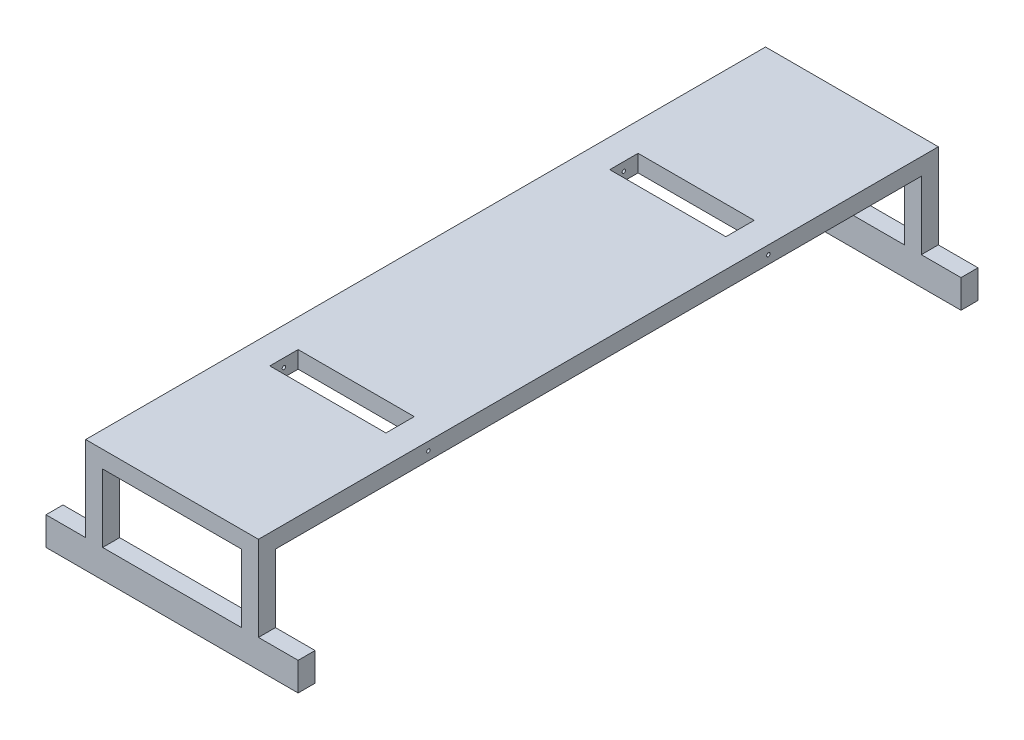
ISO-10303-21;
HEADER;
FILE_DESCRIPTION(('STEP AP214'),'2;1');
FILE_NAME('part.step','',(''),(''),'','','');
FILE_SCHEMA(('AUTOMOTIVE_DESIGN { 1 0 10303 214 1 1 1 1 }'));
ENDSEC;
DATA;
#1=APPLICATION_CONTEXT('core data for automotive mechanical design processes');
#2=APPLICATION_PROTOCOL_DEFINITION('international standard','automotive_design',2000,#1);
#3=PRODUCT_CONTEXT('',#1,'mechanical');
#4=PRODUCT('Part','Part','',(#3));
#5=PRODUCT_RELATED_PRODUCT_CATEGORY('part','',(#4));
#6=PRODUCT_DEFINITION_FORMATION('','',#4);
#7=PRODUCT_DEFINITION_CONTEXT('part definition',#1,'design');
#8=PRODUCT_DEFINITION('design','',#6,#7);
#9=PRODUCT_DEFINITION_SHAPE('','',#8);
#10=(LENGTH_UNIT() NAMED_UNIT(*) SI_UNIT(.MILLI.,.METRE.));
#11=(NAMED_UNIT(*) PLANE_ANGLE_UNIT() SI_UNIT($,.RADIAN.));
#12=(NAMED_UNIT(*) SI_UNIT($,.STERADIAN.) SOLID_ANGLE_UNIT());
#13=UNCERTAINTY_MEASURE_WITH_UNIT(LENGTH_MEASURE(1.E-05),#10,'distance_accuracy_value','');
#14=(GEOMETRIC_REPRESENTATION_CONTEXT(3) GLOBAL_UNCERTAINTY_ASSIGNED_CONTEXT((#13)) GLOBAL_UNIT_ASSIGNED_CONTEXT((#10,
#11,#12)) REPRESENTATION_CONTEXT('',''));
#15=CARTESIAN_POINT('',(0.,0.,0.));
#16=DIRECTION('',(0.,0.,1.));
#17=DIRECTION('',(1.,0.,0.));
#18=AXIS2_PLACEMENT_3D('',#15,#16,#17);
#19=CARTESIAN_POINT('',(0.,150.000000000003,1200.));
#20=DIRECTION('',(0.,1.,0.));
#21=DIRECTION('',(0.,0.,1.));
#22=AXIS2_PLACEMENT_3D('',#19,#20,#21);
#23=PLANE('',#22);
#24=DIRECTION('',(1.,0.,0.));
#25=VECTOR('',#24,1.);
#26=CARTESIAN_POINT('',(0.,150.000000000003,0.));
#27=LINE('',#26,#25);
#28=CARTESIAN_POINT('',(-152.500000000002,150.000000000003,0.));
#29=VERTEX_POINT('',#28);
#30=CARTESIAN_POINT('',(152.500000000002,150.000000000003,0.));
#31=VERTEX_POINT('',#30);
#32=EDGE_CURVE('E432',#29,#31,#27,.T.);
#33=ORIENTED_EDGE('',*,*,#32,.F.);
#34=DIRECTION('',(0.,0.,-1.));
#35=VECTOR('',#34,1.);
#36=CARTESIAN_POINT('',(-152.500000000002,150.000000000003,1200.));
#37=LINE('',#36,#35);
#38=CARTESIAN_POINT('',(-152.500000000002,150.000000000003,1200.));
#39=VERTEX_POINT('',#38);
#40=EDGE_CURVE('E466',#39,#29,#37,.T.);
#41=ORIENTED_EDGE('',*,*,#40,.F.);
#42=DIRECTION('',(1.,0.,0.));
#43=VECTOR('',#42,1.);
#44=CARTESIAN_POINT('',(0.,150.000000000003,1200.));
#45=LINE('',#44,#43);
#46=CARTESIAN_POINT('',(152.500000000002,150.000000000003,1200.));
#47=VERTEX_POINT('',#46);
#48=EDGE_CURVE('E410',#39,#47,#45,.T.);
#49=ORIENTED_EDGE('',*,*,#48,.T.);
#50=DIRECTION('',(0.,0.,-1.));
#51=VECTOR('',#50,1.);
#52=CARTESIAN_POINT('',(152.500000000002,150.000000000003,1200.));
#53=LINE('',#52,#51);
#54=EDGE_CURVE('E469',#47,#31,#53,.T.);
#55=ORIENTED_EDGE('',*,*,#54,.T.);
#56=EDGE_LOOP('',(#33,#41,#49,#55));
#57=FACE_BOUND('',#56,.T.);
#58=DIRECTION('',(1.,0.,0.));
#59=VECTOR('',#58,1.);
#60=CARTESIAN_POINT('',(102.499999999972,150.000000000003,925.));
#61=LINE('',#60,#59);
#62=CARTESIAN_POINT('',(-102.499999999972,150.000000000003,925.));
#63=VERTEX_POINT('',#62);
#64=CARTESIAN_POINT('',(102.499999999972,150.000000000003,925.));
#65=VERTEX_POINT('',#64);
#66=EDGE_CURVE('E317',#63,#65,#61,.T.);
#67=ORIENTED_EDGE('',*,*,#66,.F.);
#68=DIRECTION('',(0.,0.,1.));
#69=VECTOR('',#68,1.);
#70=CARTESIAN_POINT('',(-102.499999999972,150.000000000003,925.));
#71=LINE('',#70,#69);
#72=CARTESIAN_POINT('',(-102.499999999972,150.000000000003,875.));
#73=VERTEX_POINT('',#72);
#74=EDGE_CURVE('E269',#73,#63,#71,.T.);
#75=ORIENTED_EDGE('',*,*,#74,.F.);
#76=DIRECTION('',(-1.,0.,0.));
#77=VECTOR('',#76,1.);
#78=CARTESIAN_POINT('',(102.499999999972,150.000000000003,875.));
#79=LINE('',#78,#77);
#80=CARTESIAN_POINT('',(102.499999999972,150.000000000003,875.));
#81=VERTEX_POINT('',#80);
#82=EDGE_CURVE('E311',#81,#73,#79,.T.);
#83=ORIENTED_EDGE('',*,*,#82,.F.);
#84=DIRECTION('',(0.,0.,-1.));
#85=VECTOR('',#84,1.);
#86=CARTESIAN_POINT('',(102.499999999972,150.000000000003,925.));
#87=LINE('',#86,#85);
#88=EDGE_CURVE('E314',#65,#81,#87,.T.);
#89=ORIENTED_EDGE('',*,*,#88,.F.);
#90=EDGE_LOOP('',(#67,#75,#83,#89));
#91=FACE_BOUND('',#90,.T.);
#92=DIRECTION('',(1.,0.,0.));
#93=VECTOR('',#92,1.);
#94=CARTESIAN_POINT('',(102.5,150.000000000003,325.));
#95=LINE('',#94,#93);
#96=CARTESIAN_POINT('',(-102.5,150.000000000003,325.));
#97=VERTEX_POINT('',#96);
#98=CARTESIAN_POINT('',(102.5,150.000000000003,325.));
#99=VERTEX_POINT('',#98);
#100=EDGE_CURVE('E268',#97,#99,#95,.T.);
#101=ORIENTED_EDGE('',*,*,#100,.F.);
#102=DIRECTION('',(0.,0.,1.));
#103=VECTOR('',#102,1.);
#104=CARTESIAN_POINT('',(-102.5,150.000000000003,325.));
#105=LINE('',#104,#103);
#106=CARTESIAN_POINT('',(-102.5,150.000000000003,275.));
#107=VERTEX_POINT('',#106);
#108=EDGE_CURVE('E258',#107,#97,#105,.T.);
#109=ORIENTED_EDGE('',*,*,#108,.F.);
#110=DIRECTION('',(-1.,0.,0.));
#111=VECTOR('',#110,1.);
#112=CARTESIAN_POINT('',(102.5,150.000000000003,275.));
#113=LINE('',#112,#111);
#114=CARTESIAN_POINT('',(102.5,150.000000000003,275.));
#115=VERTEX_POINT('',#114);
#116=EDGE_CURVE('E285',#115,#107,#113,.T.);
#117=ORIENTED_EDGE('',*,*,#116,.F.);
#118=DIRECTION('',(0.,0.,-1.));
#119=VECTOR('',#118,1.);
#120=CARTESIAN_POINT('',(102.5,150.000000000003,325.));
#121=LINE('',#120,#119);
#122=EDGE_CURVE('E281',#99,#115,#121,.T.);
#123=ORIENTED_EDGE('',*,*,#122,.F.);
#124=EDGE_LOOP('',(#101,#109,#117,#123));
#125=FACE_BOUND('',#124,.T.);
#126=ADVANCED_FACE('F45',(#57,#91,#125),#23,.T.);
#127=CARTESIAN_POINT('',(0.,120.,1200.));
#128=DIRECTION('',(0.,1.,0.));
#129=DIRECTION('',(0.,0.,1.));
#130=AXIS2_PLACEMENT_3D('',#127,#128,#129);
#131=PLANE('',#130);
#132=DIRECTION('',(0.,0.,-1.));
#133=VECTOR('',#132,1.);
#134=CARTESIAN_POINT('',(-102.499999999972,120.,1200.));
#135=LINE('',#134,#133);
#136=CARTESIAN_POINT('',(-102.499999999972,120.,925.));
#137=VERTEX_POINT('',#136);
#138=CARTESIAN_POINT('',(-102.499999999972,120.,875.));
#139=VERTEX_POINT('',#138);
#140=EDGE_CURVE('E547',#137,#139,#135,.T.);
#141=ORIENTED_EDGE('',*,*,#140,.F.);
#142=DIRECTION('',(-1.,0.,0.));
#143=VECTOR('',#142,1.);
#144=CARTESIAN_POINT('',(0.,120.,925.));
#145=LINE('',#144,#143);
#146=CARTESIAN_POINT('',(102.499999999972,120.,925.));
#147=VERTEX_POINT('',#146);
#148=EDGE_CURVE('E544',#147,#137,#145,.T.);
#149=ORIENTED_EDGE('',*,*,#148,.F.);
#150=DIRECTION('',(0.,0.,1.));
#151=VECTOR('',#150,1.);
#152=CARTESIAN_POINT('',(102.499999999972,120.,1200.));
#153=LINE('',#152,#151);
#154=CARTESIAN_POINT('',(102.499999999972,120.,875.));
#155=VERTEX_POINT('',#154);
#156=EDGE_CURVE('E541',#155,#147,#153,.T.);
#157=ORIENTED_EDGE('',*,*,#156,.F.);
#158=DIRECTION('',(1.,0.,0.));
#159=VECTOR('',#158,1.);
#160=CARTESIAN_POINT('',(0.,120.,875.));
#161=LINE('',#160,#159);
#162=EDGE_CURVE('E538',#139,#155,#161,.T.);
#163=ORIENTED_EDGE('',*,*,#162,.F.);
#164=EDGE_LOOP('',(#141,#149,#157,#163));
#165=FACE_BOUND('',#164,.T.);
#166=DIRECTION('',(0.,0.,-1.));
#167=VECTOR('',#166,1.);
#168=CARTESIAN_POINT('',(122.5,120.,1200.));
#169=LINE('',#168,#167);
#170=CARTESIAN_POINT('',(122.5,120.,30.));
#171=VERTEX_POINT('',#170);
#172=CARTESIAN_POINT('',(122.5,120.,0.));
#173=VERTEX_POINT('',#172);
#174=EDGE_CURVE('E424',#171,#173,#169,.T.);
#175=ORIENTED_EDGE('',*,*,#174,.F.);
#176=DIRECTION('',(1.,0.,0.));
#177=VECTOR('',#176,1.);
#178=CARTESIAN_POINT('',(-222.5,120.000000000003,30.));
#179=LINE('',#178,#177);
#180=CARTESIAN_POINT('',(152.500000000002,120.000000000003,30.));
#181=VERTEX_POINT('',#180);
#182=EDGE_CURVE('E343',#171,#181,#179,.T.);
#183=ORIENTED_EDGE('',*,*,#182,.T.);
#184=DIRECTION('',(0.,0.,-1.));
#185=VECTOR('',#184,1.);
#186=CARTESIAN_POINT('',(152.500000000002,120.000000000003,1200.));
#187=LINE('',#186,#185);
#188=CARTESIAN_POINT('',(152.500000000002,120.000000000003,1170.));
#189=VERTEX_POINT('',#188);
#190=EDGE_CURVE('E397',#189,#181,#187,.T.);
#191=ORIENTED_EDGE('',*,*,#190,.F.);
#192=DIRECTION('',(1.,0.,0.));
#193=VECTOR('',#192,1.);
#194=CARTESIAN_POINT('',(-222.5,120.000000000003,1170.));
#195=LINE('',#194,#193);
#196=CARTESIAN_POINT('',(122.5,120.000000000003,1170.));
#197=VERTEX_POINT('',#196);
#198=EDGE_CURVE('E354',#197,#189,#195,.T.);
#199=ORIENTED_EDGE('',*,*,#198,.F.);
#200=CARTESIAN_POINT('',(122.5,120.,1200.));
#201=VERTEX_POINT('',#200);
#202=EDGE_CURVE('E447',#201,#197,#169,.T.);
#203=ORIENTED_EDGE('',*,*,#202,.F.);
#204=DIRECTION('',(1.,0.,0.));
#205=VECTOR('',#204,1.);
#206=CARTESIAN_POINT('',(0.,120.,1200.));
#207=LINE('',#206,#205);
#208=CARTESIAN_POINT('',(-122.5,120.,1200.));
#209=VERTEX_POINT('',#208);
#210=EDGE_CURVE('E421',#209,#201,#207,.T.);
#211=ORIENTED_EDGE('',*,*,#210,.F.);
#212=DIRECTION('',(0.,0.,-1.));
#213=VECTOR('',#212,1.);
#214=CARTESIAN_POINT('',(-122.5,120.,1200.));
#215=LINE('',#214,#213);
#216=CARTESIAN_POINT('',(-122.5,120.000000000003,1170.));
#217=VERTEX_POINT('',#216);
#218=EDGE_CURVE('E452',#209,#217,#215,.T.);
#219=ORIENTED_EDGE('',*,*,#218,.T.);
#220=CARTESIAN_POINT('',(-152.500000000002,120.000000000003,1170.));
#221=VERTEX_POINT('',#220);
#222=EDGE_CURVE('E358',#221,#217,#195,.T.);
#223=ORIENTED_EDGE('',*,*,#222,.F.);
#224=DIRECTION('',(0.,0.,-1.));
#225=VECTOR('',#224,1.);
#226=CARTESIAN_POINT('',(-152.500000000002,120.000000000003,1200.));
#227=LINE('',#226,#225);
#228=CARTESIAN_POINT('',(-152.500000000002,120.000000000003,29.9999999999999));
#229=VERTEX_POINT('',#228);
#230=EDGE_CURVE('E393',#221,#229,#227,.T.);
#231=ORIENTED_EDGE('',*,*,#230,.T.);
#232=CARTESIAN_POINT('',(-122.5,120.000000000003,30.));
#233=VERTEX_POINT('',#232);
#234=EDGE_CURVE('E359',#229,#233,#179,.T.);
#235=ORIENTED_EDGE('',*,*,#234,.T.);
#236=CARTESIAN_POINT('',(-122.5,120.,0.));
#237=VERTEX_POINT('',#236);
#238=EDGE_CURVE('E451',#233,#237,#215,.T.);
#239=ORIENTED_EDGE('',*,*,#238,.T.);
#240=DIRECTION('',(1.,0.,0.));
#241=VECTOR('',#240,1.);
#242=CARTESIAN_POINT('',(0.,120.,0.));
#243=LINE('',#242,#241);
#244=EDGE_CURVE('E407',#237,#173,#243,.T.);
#245=ORIENTED_EDGE('',*,*,#244,.T.);
#246=EDGE_LOOP('',(#175,#183,#191,#199,#203,#211,#219,#223,#231,#235,#239,#245));
#247=FACE_BOUND('',#246,.T.);
#248=DIRECTION('',(0.,0.,-1.));
#249=VECTOR('',#248,1.);
#250=CARTESIAN_POINT('',(-102.5,120.,1200.));
#251=LINE('',#250,#249);
#252=CARTESIAN_POINT('',(-102.5,120.,325.));
#253=VERTEX_POINT('',#252);
#254=CARTESIAN_POINT('',(-102.5,120.,275.));
#255=VERTEX_POINT('',#254);
#256=EDGE_CURVE('E11',#253,#255,#251,.T.);
#257=ORIENTED_EDGE('',*,*,#256,.F.);
#258=DIRECTION('',(-1.,0.,0.));
#259=VECTOR('',#258,1.);
#260=CARTESIAN_POINT('',(-4.73875681242445E-13,120.,325.));
#261=LINE('',#260,#259);
#262=CARTESIAN_POINT('',(102.5,120.,325.));
#263=VERTEX_POINT('',#262);
#264=EDGE_CURVE('E55',#263,#253,#261,.T.);
#265=ORIENTED_EDGE('',*,*,#264,.F.);
#266=DIRECTION('',(0.,0.,1.));
#267=VECTOR('',#266,1.);
#268=CARTESIAN_POINT('',(102.5,120.,1200.));
#269=LINE('',#268,#267);
#270=CARTESIAN_POINT('',(102.5,120.,275.));
#271=VERTEX_POINT('',#270);
#272=EDGE_CURVE('E554',#271,#263,#269,.T.);
#273=ORIENTED_EDGE('',*,*,#272,.F.);
#274=DIRECTION('',(1.,0.,0.));
#275=VECTOR('',#274,1.);
#276=CARTESIAN_POINT('',(-2.50477145799578E-13,120.,275.));
#277=LINE('',#276,#275);
#278=EDGE_CURVE('E551',#255,#271,#277,.T.);
#279=ORIENTED_EDGE('',*,*,#278,.F.);
#280=EDGE_LOOP('',(#257,#265,#273,#279));
#281=FACE_BOUND('',#280,.T.);
#282=ADVANCED_FACE('F608',(#165,#247,#281),#131,.F.);
#283=CARTESIAN_POINT('',(0.,0.,1200.));
#284=DIRECTION('',(0.,1.,0.));
#285=DIRECTION('',(-1.,0.,0.));
#286=AXIS2_PLACEMENT_3D('',#283,#284,#285);
#287=PLANE('',#286);
#288=DIRECTION('',(-1.,0.,0.));
#289=VECTOR('',#288,1.);
#290=CARTESIAN_POINT('',(-152.500000000002,0.,30.0000000000006));
#291=LINE('',#290,#289);
#292=CARTESIAN_POINT('',(222.499999999998,0.,30.));
#293=VERTEX_POINT('',#292);
#294=CARTESIAN_POINT('',(152.500000000002,0.,30.0000000000002));
#295=VERTEX_POINT('',#294);
#296=EDGE_CURVE('E327',#293,#295,#291,.T.);
#297=ORIENTED_EDGE('',*,*,#296,.F.);
#298=DIRECTION('',(0.,0.,-1.));
#299=VECTOR('',#298,1.);
#300=CARTESIAN_POINT('',(222.499999999998,0.,1200.));
#301=LINE('',#300,#299);
#302=CARTESIAN_POINT('',(222.499999999998,0.,0.));
#303=VERTEX_POINT('',#302);
#304=EDGE_CURVE('E501',#293,#303,#301,.T.);
#305=ORIENTED_EDGE('',*,*,#304,.T.);
#306=DIRECTION('',(1.,0.,0.));
#307=VECTOR('',#306,1.);
#308=CARTESIAN_POINT('',(0.,0.,0.));
#309=LINE('',#308,#307);
#310=CARTESIAN_POINT('',(152.500000000002,0.,0.));
#311=VERTEX_POINT('',#310);
#312=EDGE_CURVE('E482',#311,#303,#309,.T.);
#313=ORIENTED_EDGE('',*,*,#312,.F.);
#314=DIRECTION('',(0.,0.,-1.));
#315=VECTOR('',#314,1.);
#316=CARTESIAN_POINT('',(152.500000000002,0.,1200.));
#317=LINE('',#316,#315);
#318=EDGE_CURVE('E472',#295,#311,#317,.T.);
#319=ORIENTED_EDGE('',*,*,#318,.F.);
#320=EDGE_LOOP('',(#297,#305,#313,#319));
#321=FACE_BOUND('',#320,.T.);
#322=ADVANCED_FACE('F614',(#321),#287,.T.);
#323=CARTESIAN_POINT('',(122.5,0.,30.0000000000026));
#324=VERTEX_POINT('',#323);
#325=CARTESIAN_POINT('',(-122.5,0.,30.0000000000008));
#326=VERTEX_POINT('',#325);
#327=EDGE_CURVE('E339',#324,#326,#291,.T.);
#328=ORIENTED_EDGE('',*,*,#327,.F.);
#329=DIRECTION('',(0.,0.,-1.));
#330=VECTOR('',#329,1.);
#331=CARTESIAN_POINT('',(122.5,0.,1200.));
#332=LINE('',#331,#330);
#333=CARTESIAN_POINT('',(122.5,0.,0.));
#334=VERTEX_POINT('',#333);
#335=EDGE_CURVE('E477',#324,#334,#332,.T.);
#336=ORIENTED_EDGE('',*,*,#335,.T.);
#337=CARTESIAN_POINT('',(-122.5,0.,0.));
#338=VERTEX_POINT('',#337);
#339=EDGE_CURVE('E507',#338,#334,#309,.T.);
#340=ORIENTED_EDGE('',*,*,#339,.F.);
#341=DIRECTION('',(0.,0.,-1.));
#342=VECTOR('',#341,1.);
#343=CARTESIAN_POINT('',(-122.5,0.,1200.));
#344=LINE('',#343,#342);
#345=EDGE_CURVE('E456',#326,#338,#344,.T.);
#346=ORIENTED_EDGE('',*,*,#345,.F.);
#347=EDGE_LOOP('',(#328,#336,#340,#346));
#348=FACE_BOUND('',#347,.T.);
#349=ADVANCED_FACE('F938',(#348),#287,.T.);
#350=CARTESIAN_POINT('',(-152.500000000002,0.,30.0000000000006));
#351=VERTEX_POINT('',#350);
#352=CARTESIAN_POINT('',(-222.499999999998,0.,30.));
#353=VERTEX_POINT('',#352);
#354=EDGE_CURVE('E335',#351,#353,#291,.T.);
#355=ORIENTED_EDGE('',*,*,#354,.F.);
#356=DIRECTION('',(0.,0.,-1.));
#357=VECTOR('',#356,1.);
#358=CARTESIAN_POINT('',(-152.500000000002,0.,1200.));
#359=LINE('',#358,#357);
#360=CARTESIAN_POINT('',(-152.500000000002,0.,0.));
#361=VERTEX_POINT('',#360);
#362=EDGE_CURVE('E461',#351,#361,#359,.T.);
#363=ORIENTED_EDGE('',*,*,#362,.T.);
#364=CARTESIAN_POINT('',(-222.499999999998,0.,0.));
#365=VERTEX_POINT('',#364);
#366=EDGE_CURVE('E502',#365,#361,#309,.T.);
#367=ORIENTED_EDGE('',*,*,#366,.F.);
#368=DIRECTION('',(0.,0.,-1.));
#369=VECTOR('',#368,1.);
#370=CARTESIAN_POINT('',(-222.499999999998,0.,1200.));
#371=LINE('',#370,#369);
#372=EDGE_CURVE('E533',#353,#365,#371,.T.);
#373=ORIENTED_EDGE('',*,*,#372,.F.);
#374=EDGE_LOOP('',(#355,#363,#367,#373));
#375=FACE_BOUND('',#374,.T.);
#376=ADVANCED_FACE('F673',(#375),#287,.T.);
#377=DIRECTION('',(1.,0.,0.));
#378=VECTOR('',#377,1.);
#379=CARTESIAN_POINT('',(222.499999999998,0.,1170.));
#380=LINE('',#379,#378);
#381=CARTESIAN_POINT('',(-222.499999999998,0.,1170.));
#382=VERTEX_POINT('',#381);
#383=CARTESIAN_POINT('',(-152.500000000002,0.,1170.));
#384=VERTEX_POINT('',#383);
#385=EDGE_CURVE('E332',#382,#384,#380,.T.);
#386=ORIENTED_EDGE('',*,*,#385,.F.);
#387=CARTESIAN_POINT('',(-222.499999999998,0.,1200.));
#388=VERTEX_POINT('',#387);
#389=EDGE_CURVE('E534',#388,#382,#371,.T.);
#390=ORIENTED_EDGE('',*,*,#389,.F.);
#391=DIRECTION('',(1.,0.,0.));
#392=VECTOR('',#391,1.);
#393=CARTESIAN_POINT('',(0.,0.,1200.));
#394=LINE('',#393,#392);
#395=CARTESIAN_POINT('',(-152.500000000002,0.,1200.));
#396=VERTEX_POINT('',#395);
#397=EDGE_CURVE('E483',#388,#396,#394,.T.);
#398=ORIENTED_EDGE('',*,*,#397,.T.);
#399=EDGE_CURVE('E462',#396,#384,#359,.T.);
#400=ORIENTED_EDGE('',*,*,#399,.T.);
#401=EDGE_LOOP('',(#386,#390,#398,#400));
#402=FACE_BOUND('',#401,.T.);
#403=ADVANCED_FACE('F665',(#402),#287,.T.);
#404=CARTESIAN_POINT('',(-122.5,0.,1170.));
#405=VERTEX_POINT('',#404);
#406=CARTESIAN_POINT('',(122.5,-1.4328367550024E-13,1170.));
#407=VERTEX_POINT('',#406);
#408=EDGE_CURVE('E336',#405,#407,#380,.T.);
#409=ORIENTED_EDGE('',*,*,#408,.F.);
#410=CARTESIAN_POINT('',(-122.5,0.,1200.));
#411=VERTEX_POINT('',#410);
#412=EDGE_CURVE('E457',#411,#405,#344,.T.);
#413=ORIENTED_EDGE('',*,*,#412,.F.);
#414=CARTESIAN_POINT('',(122.5,0.,1200.));
#415=VERTEX_POINT('',#414);
#416=EDGE_CURVE('E488',#411,#415,#394,.T.);
#417=ORIENTED_EDGE('',*,*,#416,.T.);
#418=EDGE_CURVE('E478',#415,#407,#332,.T.);
#419=ORIENTED_EDGE('',*,*,#418,.T.);
#420=EDGE_LOOP('',(#409,#413,#417,#419));
#421=FACE_BOUND('',#420,.T.);
#422=ADVANCED_FACE('F656',(#421),#287,.T.);
#423=CARTESIAN_POINT('',(-222.499999999998,7.53425100086241E-12,1200.));
#424=DIRECTION('',(-1.,0.,0.));
#425=DIRECTION('',(0.,-1.,0.));
#426=AXIS2_PLACEMENT_3D('',#423,#424,#425);
#427=PLANE('',#426);
#428=DIRECTION('',(0.,1.,0.));
#429=VECTOR('',#428,1.);
#430=CARTESIAN_POINT('',(-222.499999999998,-50.,30.));
#431=LINE('',#430,#429);
#432=CARTESIAN_POINT('',(-222.499999999998,-50.,30.));
#433=VERTEX_POINT('',#432);
#434=EDGE_CURVE('E344',#433,#353,#431,.T.);
#435=ORIENTED_EDGE('',*,*,#434,.T.);
#436=ORIENTED_EDGE('',*,*,#372,.T.);
#437=DIRECTION('',(0.,1.,0.));
#438=VECTOR('',#437,1.);
#439=CARTESIAN_POINT('',(-222.499999999998,7.53425100086241E-12,0.));
#440=LINE('',#439,#438);
#441=CARTESIAN_POINT('',(-222.5,-50.,0.));
#442=VERTEX_POINT('',#441);
#443=EDGE_CURVE('E506',#442,#365,#440,.T.);
#444=ORIENTED_EDGE('',*,*,#443,.F.);
#445=DIRECTION('',(0.,0.,-1.));
#446=VECTOR('',#445,1.);
#447=CARTESIAN_POINT('',(-222.5,-50.,1200.));
#448=LINE('',#447,#446);
#449=EDGE_CURVE('E528',#433,#442,#448,.T.);
#450=ORIENTED_EDGE('',*,*,#449,.F.);
#451=EDGE_LOOP('',(#435,#436,#444,#450));
#452=FACE_BOUND('',#451,.T.);
#453=ADVANCED_FACE('F650',(#452),#427,.T.);
#454=CARTESIAN_POINT('',(0.,-50.,1200.));
#455=DIRECTION('',(0.,-1.,0.));
#456=DIRECTION('',(0.,0.,-1.));
#457=AXIS2_PLACEMENT_3D('',#454,#455,#456);
#458=PLANE('',#457);
#459=DIRECTION('',(-1.,0.,0.));
#460=VECTOR('',#459,1.);
#461=CARTESIAN_POINT('',(152.500000000002,-50.,30.0000000000002));
#462=LINE('',#461,#460);
#463=CARTESIAN_POINT('',(222.499999999998,-50.,30.));
#464=VERTEX_POINT('',#463);
#465=EDGE_CURVE('E326',#464,#433,#462,.T.);
#466=ORIENTED_EDGE('',*,*,#465,.T.);
#467=ORIENTED_EDGE('',*,*,#449,.T.);
#468=DIRECTION('',(-1.,0.,0.));
#469=VECTOR('',#468,1.);
#470=CARTESIAN_POINT('',(0.,-50.,0.));
#471=LINE('',#470,#469);
#472=CARTESIAN_POINT('',(222.5,-50.,0.));
#473=VERTEX_POINT('',#472);
#474=EDGE_CURVE('E511',#473,#442,#471,.T.);
#475=ORIENTED_EDGE('',*,*,#474,.F.);
#476=DIRECTION('',(0.,0.,-1.));
#477=VECTOR('',#476,1.);
#478=CARTESIAN_POINT('',(222.5,-50.,1200.));
#479=LINE('',#478,#477);
#480=EDGE_CURVE('E523',#464,#473,#479,.T.);
#481=ORIENTED_EDGE('',*,*,#480,.F.);
#482=EDGE_LOOP('',(#466,#467,#475,#481));
#483=FACE_BOUND('',#482,.T.);
#484=ADVANCED_FACE('F647',(#483),#458,.T.);
#485=CARTESIAN_POINT('',(222.499999999998,7.53425100086241E-12,1200.));
#486=DIRECTION('',(-1.,0.,0.));
#487=DIRECTION('',(0.,-1.,0.));
#488=AXIS2_PLACEMENT_3D('',#485,#486,#487);
#489=PLANE('',#488);
#490=ORIENTED_EDGE('',*,*,#304,.F.);
#491=DIRECTION('',(0.,1.,0.));
#492=VECTOR('',#491,1.);
#493=CARTESIAN_POINT('',(222.499999999998,-50.,30.));
#494=LINE('',#493,#492);
#495=EDGE_CURVE('E348',#464,#293,#494,.T.);
#496=ORIENTED_EDGE('',*,*,#495,.F.);
#497=ORIENTED_EDGE('',*,*,#480,.T.);
#498=DIRECTION('',(0.,1.,0.));
#499=VECTOR('',#498,1.);
#500=CARTESIAN_POINT('',(222.499999999998,7.53425100086241E-12,0.));
#501=LINE('',#500,#499);
#502=EDGE_CURVE('E515',#473,#303,#501,.T.);
#503=ORIENTED_EDGE('',*,*,#502,.T.);
#504=EDGE_LOOP('',(#490,#496,#497,#503));
#505=FACE_BOUND('',#504,.T.);
#506=ADVANCED_FACE('F643',(#505),#489,.F.);
#507=CARTESIAN_POINT('',(122.5,0.,1200.));
#508=DIRECTION('',(-1.,0.,0.));
#509=DIRECTION('',(0.,0.,1.));
#510=AXIS2_PLACEMENT_3D('',#507,#508,#509);
#511=PLANE('',#510);
#512=DIRECTION('',(0.,1.,0.));
#513=VECTOR('',#512,1.);
#514=CARTESIAN_POINT('',(122.5,0.,1170.));
#515=LINE('',#514,#513);
#516=EDGE_CURVE('E390',#407,#197,#515,.T.);
#517=ORIENTED_EDGE('',*,*,#516,.F.);
#518=ORIENTED_EDGE('',*,*,#418,.F.);
#519=DIRECTION('',(0.,1.,0.));
#520=VECTOR('',#519,1.);
#521=CARTESIAN_POINT('',(122.5,0.,1200.));
#522=LINE('',#521,#520);
#523=EDGE_CURVE('E402',#415,#201,#522,.T.);
#524=ORIENTED_EDGE('',*,*,#523,.T.);
#525=ORIENTED_EDGE('',*,*,#202,.T.);
#526=EDGE_LOOP('',(#517,#518,#524,#525));
#527=FACE_BOUND('',#526,.T.);
#528=ADVANCED_FACE('F630',(#527),#511,.T.);
#529=CARTESIAN_POINT('',(-122.5,0.,1200.));
#530=DIRECTION('',(-1.,0.,0.));
#531=DIRECTION('',(0.,0.,1.));
#532=AXIS2_PLACEMENT_3D('',#529,#530,#531);
#533=PLANE('',#532);
#534=ORIENTED_EDGE('',*,*,#412,.T.);
#535=DIRECTION('',(0.,1.,0.));
#536=VECTOR('',#535,1.);
#537=CARTESIAN_POINT('',(-122.5,0.,1170.));
#538=LINE('',#537,#536);
#539=EDGE_CURVE('E379',#405,#217,#538,.T.);
#540=ORIENTED_EDGE('',*,*,#539,.T.);
#541=ORIENTED_EDGE('',*,*,#218,.F.);
#542=DIRECTION('',(0.,1.,0.));
#543=VECTOR('',#542,1.);
#544=CARTESIAN_POINT('',(-122.5,0.,1200.));
#545=LINE('',#544,#543);
#546=EDGE_CURVE('E418',#411,#209,#545,.T.);
#547=ORIENTED_EDGE('',*,*,#546,.F.);
#548=EDGE_LOOP('',(#534,#540,#541,#547));
#549=FACE_BOUND('',#548,.T.);
#550=ADVANCED_FACE('F654',(#549),#533,.F.);
#551=CARTESIAN_POINT('',(152.500000000002,0.,1170.));
#552=VERTEX_POINT('',#551);
#553=CARTESIAN_POINT('',(222.499999999998,0.,1170.));
#554=VERTEX_POINT('',#553);
#555=EDGE_CURVE('E277',#552,#554,#380,.T.);
#556=ORIENTED_EDGE('',*,*,#555,.F.);
#557=CARTESIAN_POINT('',(152.500000000002,0.,1200.));
#558=VERTEX_POINT('',#557);
#559=EDGE_CURVE('E473',#558,#552,#317,.T.);
#560=ORIENTED_EDGE('',*,*,#559,.F.);
#561=CARTESIAN_POINT('',(222.499999999998,0.,1200.));
#562=VERTEX_POINT('',#561);
#563=EDGE_CURVE('E489',#558,#562,#394,.T.);
#564=ORIENTED_EDGE('',*,*,#563,.T.);
#565=EDGE_CURVE('E519',#562,#554,#301,.T.);
#566=ORIENTED_EDGE('',*,*,#565,.T.);
#567=EDGE_LOOP('',(#556,#560,#564,#566));
#568=FACE_BOUND('',#567,.T.);
#569=ADVANCED_FACE('F47',(#568),#287,.T.);
#570=DIRECTION('',(0.,1.,0.));
#571=VECTOR('',#570,1.);
#572=CARTESIAN_POINT('',(-222.499999999998,-50.,1170.));
#573=LINE('',#572,#571);
#574=CARTESIAN_POINT('',(-222.499999999998,-50.,1170.));
#575=VERTEX_POINT('',#574);
#576=EDGE_CURVE('E340',#575,#382,#573,.T.);
#577=ORIENTED_EDGE('',*,*,#576,.F.);
#578=CARTESIAN_POINT('',(-222.5,-50.,1200.));
#579=VERTEX_POINT('',#578);
#580=EDGE_CURVE('E529',#579,#575,#448,.T.);
#581=ORIENTED_EDGE('',*,*,#580,.F.);
#582=DIRECTION('',(0.,1.,0.));
#583=VECTOR('',#582,1.);
#584=CARTESIAN_POINT('',(-222.499999999998,7.53425100086241E-12,1200.));
#585=LINE('',#584,#583);
#586=EDGE_CURVE('E487',#579,#388,#585,.T.);
#587=ORIENTED_EDGE('',*,*,#586,.T.);
#588=ORIENTED_EDGE('',*,*,#389,.T.);
#589=EDGE_LOOP('',(#577,#581,#587,#588));
#590=FACE_BOUND('',#589,.T.);
#591=ADVANCED_FACE('F645',(#590),#427,.T.);
#592=DIRECTION('',(1.,0.,0.));
#593=VECTOR('',#592,1.);
#594=CARTESIAN_POINT('',(-222.499999999998,-50.,1170.));
#595=LINE('',#594,#593);
#596=CARTESIAN_POINT('',(222.499999999998,-50.,1170.));
#597=VERTEX_POINT('',#596);
#598=EDGE_CURVE('E322',#575,#597,#595,.T.);
#599=ORIENTED_EDGE('',*,*,#598,.T.);
#600=CARTESIAN_POINT('',(222.5,-50.,1200.));
#601=VERTEX_POINT('',#600);
#602=EDGE_CURVE('E524',#601,#597,#479,.T.);
#603=ORIENTED_EDGE('',*,*,#602,.F.);
#604=DIRECTION('',(-1.,0.,0.));
#605=VECTOR('',#604,1.);
#606=CARTESIAN_POINT('',(0.,-50.,1200.));
#607=LINE('',#606,#605);
#608=EDGE_CURVE('E493',#601,#579,#607,.T.);
#609=ORIENTED_EDGE('',*,*,#608,.T.);
#610=ORIENTED_EDGE('',*,*,#580,.T.);
#611=EDGE_LOOP('',(#599,#603,#609,#610));
#612=FACE_BOUND('',#611,.T.);
#613=ADVANCED_FACE('F641',(#612),#458,.T.);
#614=ORIENTED_EDGE('',*,*,#602,.T.);
#615=DIRECTION('',(0.,1.,0.));
#616=VECTOR('',#615,1.);
#617=CARTESIAN_POINT('',(222.499999999998,-50.,1170.));
#618=LINE('',#617,#616);
#619=EDGE_CURVE('E331',#597,#554,#618,.T.);
#620=ORIENTED_EDGE('',*,*,#619,.T.);
#621=ORIENTED_EDGE('',*,*,#565,.F.);
#622=DIRECTION('',(0.,1.,0.));
#623=VECTOR('',#622,1.);
#624=CARTESIAN_POINT('',(222.499999999998,7.53425100086241E-12,1200.));
#625=LINE('',#624,#623);
#626=EDGE_CURVE('E497',#601,#562,#625,.T.);
#627=ORIENTED_EDGE('',*,*,#626,.F.);
#628=EDGE_LOOP('',(#614,#620,#621,#627));
#629=FACE_BOUND('',#628,.T.);
#630=ADVANCED_FACE('F634',(#629),#489,.F.);
#631=CARTESIAN_POINT('',(0.,0.,1200.));
#632=DIRECTION('',(0.,0.,1.));
#633=DIRECTION('',(1.,0.,0.));
#634=AXIS2_PLACEMENT_3D('',#631,#632,#633);
#635=PLANE('',#634);
#636=ORIENTED_EDGE('',*,*,#563,.F.);
#637=DIRECTION('',(0.,1.,0.));
#638=VECTOR('',#637,1.);
#639=CARTESIAN_POINT('',(152.500000000002,0.,1200.));
#640=LINE('',#639,#638);
#641=EDGE_CURVE('E406',#558,#47,#640,.T.);
#642=ORIENTED_EDGE('',*,*,#641,.T.);
#643=ORIENTED_EDGE('',*,*,#48,.F.);
#644=DIRECTION('',(0.,1.,0.));
#645=VECTOR('',#644,1.);
#646=CARTESIAN_POINT('',(-152.500000000002,0.,1200.));
#647=LINE('',#646,#645);
#648=EDGE_CURVE('E414',#396,#39,#647,.T.);
#649=ORIENTED_EDGE('',*,*,#648,.F.);
#650=ORIENTED_EDGE('',*,*,#397,.F.);
#651=ORIENTED_EDGE('',*,*,#586,.F.);
#652=ORIENTED_EDGE('',*,*,#608,.F.);
#653=ORIENTED_EDGE('',*,*,#626,.T.);
#654=EDGE_LOOP('',(#636,#642,#643,#649,#650,#651,#652,#653));
#655=FACE_BOUND('',#654,.T.);
#656=ORIENTED_EDGE('',*,*,#523,.F.);
#657=ORIENTED_EDGE('',*,*,#416,.F.);
#658=ORIENTED_EDGE('',*,*,#546,.T.);
#659=ORIENTED_EDGE('',*,*,#210,.T.);
#660=EDGE_LOOP('',(#656,#657,#658,#659));
#661=FACE_BOUND('',#660,.T.);
#662=ADVANCED_FACE('F631',(#655,#661),#635,.T.);
#663=CARTESIAN_POINT('',(0.,0.,0.));
#664=DIRECTION('',(0.,0.,1.));
#665=DIRECTION('',(1.,0.,0.));
#666=AXIS2_PLACEMENT_3D('',#663,#664,#665);
#667=PLANE('',#666);
#668=DIRECTION('',(0.,1.,0.));
#669=VECTOR('',#668,1.);
#670=CARTESIAN_POINT('',(152.500000000002,0.,0.));
#671=LINE('',#670,#669);
#672=EDGE_CURVE('E428',#311,#31,#671,.T.);
#673=ORIENTED_EDGE('',*,*,#672,.F.);
#674=ORIENTED_EDGE('',*,*,#312,.T.);
#675=ORIENTED_EDGE('',*,*,#502,.F.);
#676=ORIENTED_EDGE('',*,*,#474,.T.);
#677=ORIENTED_EDGE('',*,*,#443,.T.);
#678=ORIENTED_EDGE('',*,*,#366,.T.);
#679=DIRECTION('',(0.,1.,0.));
#680=VECTOR('',#679,1.);
#681=CARTESIAN_POINT('',(-152.500000000002,0.,0.));
#682=LINE('',#681,#680);
#683=EDGE_CURVE('E436',#361,#29,#682,.T.);
#684=ORIENTED_EDGE('',*,*,#683,.T.);
#685=ORIENTED_EDGE('',*,*,#32,.T.);
#686=EDGE_LOOP('',(#673,#674,#675,#676,#677,#678,#684,#685));
#687=FACE_BOUND('',#686,.T.);
#688=ORIENTED_EDGE('',*,*,#339,.T.);
#689=DIRECTION('',(0.,1.,0.));
#690=VECTOR('',#689,1.);
#691=CARTESIAN_POINT('',(122.5,0.,0.));
#692=LINE('',#691,#690);
#693=EDGE_CURVE('E401',#334,#173,#692,.T.);
#694=ORIENTED_EDGE('',*,*,#693,.T.);
#695=ORIENTED_EDGE('',*,*,#244,.F.);
#696=DIRECTION('',(0.,1.,0.));
#697=VECTOR('',#696,1.);
#698=CARTESIAN_POINT('',(-122.5,0.,0.));
#699=LINE('',#698,#697);
#700=EDGE_CURVE('E440',#338,#237,#699,.T.);
#701=ORIENTED_EDGE('',*,*,#700,.F.);
#702=EDGE_LOOP('',(#688,#694,#695,#701));
#703=FACE_BOUND('',#702,.T.);
#704=ADVANCED_FACE('F628',(#687,#703),#667,.F.);
#705=DIRECTION('',(0.,-1.,0.));
#706=VECTOR('',#705,1.);
#707=CARTESIAN_POINT('',(122.5,-5.17554749057668E-12,30.0000000000005));
#708=LINE('',#707,#706);
#709=EDGE_CURVE('E375',#171,#324,#708,.T.);
#710=ORIENTED_EDGE('',*,*,#709,.F.);
#711=ORIENTED_EDGE('',*,*,#174,.T.);
#712=ORIENTED_EDGE('',*,*,#693,.F.);
#713=ORIENTED_EDGE('',*,*,#335,.F.);
#714=EDGE_LOOP('',(#710,#711,#712,#713));
#715=FACE_BOUND('',#714,.T.);
#716=ADVANCED_FACE('F625',(#715),#511,.T.);
#717=CARTESIAN_POINT('',(152.500000000002,0.,1200.));
#718=DIRECTION('',(-1.,0.,0.));
#719=DIRECTION('',(0.,0.,1.));
#720=AXIS2_PLACEMENT_3D('',#717,#718,#719);
#721=PLANE('',#720);
#722=CARTESIAN_POINT('',(152.500000000002,135.000000000003,900.));
#723=DIRECTION('',(-1.,0.,0.));
#724=DIRECTION('',(0.,0.,1.));
#725=AXIS2_PLACEMENT_3D('',#722,#723,#724);
#726=CIRCLE('',#725,3.04999999999996);
#727=CARTESIAN_POINT('',(152.500000000002,135.000000000003,903.05));
#728=VERTEX_POINT('',#727);
#729=EDGE_CURVE('E302',#728,#728,#726,.T.);
#730=ORIENTED_EDGE('',*,*,#729,.T.);
#731=EDGE_LOOP('',(#730));
#732=FACE_BOUND('',#731,.T.);
#733=CARTESIAN_POINT('',(152.500000000002,134.999999999997,300.000000000006));
#734=DIRECTION('',(-1.,0.,0.));
#735=DIRECTION('',(0.,0.,1.));
#736=AXIS2_PLACEMENT_3D('',#733,#734,#735);
#737=CIRCLE('',#736,3.05000000000002);
#738=CARTESIAN_POINT('',(152.500000000002,134.999999999997,303.050000000006));
#739=VERTEX_POINT('',#738);
#740=EDGE_CURVE('E572',#739,#739,#737,.T.);
#741=ORIENTED_EDGE('',*,*,#740,.T.);
#742=EDGE_LOOP('',(#741));
#743=FACE_BOUND('',#742,.T.);
#744=ORIENTED_EDGE('',*,*,#559,.T.);
#745=DIRECTION('',(0.,1.,0.));
#746=VECTOR('',#745,1.);
#747=CARTESIAN_POINT('',(152.500000000002,0.,1170.));
#748=LINE('',#747,#746);
#749=EDGE_CURVE('E386',#552,#189,#748,.T.);
#750=ORIENTED_EDGE('',*,*,#749,.T.);
#751=ORIENTED_EDGE('',*,*,#190,.T.);
#752=DIRECTION('',(0.,-1.,0.));
#753=VECTOR('',#752,1.);
#754=CARTESIAN_POINT('',(152.500000000002,-5.17554749057668E-12,30.0000000000005));
#755=LINE('',#754,#753);
#756=EDGE_CURVE('E371',#181,#295,#755,.T.);
#757=ORIENTED_EDGE('',*,*,#756,.T.);
#758=ORIENTED_EDGE('',*,*,#318,.T.);
#759=ORIENTED_EDGE('',*,*,#672,.T.);
#760=ORIENTED_EDGE('',*,*,#54,.F.);
#761=ORIENTED_EDGE('',*,*,#641,.F.);
#762=EDGE_LOOP('',(#744,#750,#751,#757,#758,#759,#760,#761));
#763=FACE_BOUND('',#762,.T.);
#764=ADVANCED_FACE('F589',(#732,#743,#763),#721,.F.);
#765=CARTESIAN_POINT('',(-152.500000000002,0.,1200.));
#766=DIRECTION('',(-1.,0.,0.));
#767=DIRECTION('',(0.,0.,1.));
#768=AXIS2_PLACEMENT_3D('',#765,#766,#767);
#769=PLANE('',#768);
#770=CARTESIAN_POINT('',(-152.500000000002,135.000000000003,900.));
#771=DIRECTION('',(-1.,0.,0.));
#772=DIRECTION('',(0.,0.,1.));
#773=AXIS2_PLACEMENT_3D('',#770,#771,#772);
#774=CIRCLE('',#773,3.04999999999996);
#775=CARTESIAN_POINT('',(-152.500000000002,135.000000000003,903.05));
#776=VERTEX_POINT('',#775);
#777=EDGE_CURVE('E582',#776,#776,#774,.T.);
#778=ORIENTED_EDGE('',*,*,#777,.F.);
#779=EDGE_LOOP('',(#778));
#780=FACE_BOUND('',#779,.T.);
#781=CARTESIAN_POINT('',(-152.500000000002,134.999999999997,300.000000000006));
#782=DIRECTION('',(-1.,0.,0.));
#783=DIRECTION('',(0.,0.,1.));
#784=AXIS2_PLACEMENT_3D('',#781,#782,#783);
#785=CIRCLE('',#784,3.05000000000002);
#786=CARTESIAN_POINT('',(-152.500000000002,134.999999999997,303.050000000006));
#787=VERTEX_POINT('',#786);
#788=EDGE_CURVE('E566',#787,#787,#785,.T.);
#789=ORIENTED_EDGE('',*,*,#788,.F.);
#790=EDGE_LOOP('',(#789));
#791=FACE_BOUND('',#790,.T.);
#792=DIRECTION('',(0.,1.,0.));
#793=VECTOR('',#792,1.);
#794=CARTESIAN_POINT('',(-152.500000000002,0.,1170.));
#795=LINE('',#794,#793);
#796=EDGE_CURVE('E383',#384,#221,#795,.T.);
#797=ORIENTED_EDGE('',*,*,#796,.F.);
#798=ORIENTED_EDGE('',*,*,#399,.F.);
#799=ORIENTED_EDGE('',*,*,#648,.T.);
#800=ORIENTED_EDGE('',*,*,#40,.T.);
#801=ORIENTED_EDGE('',*,*,#683,.F.);
#802=ORIENTED_EDGE('',*,*,#362,.F.);
#803=DIRECTION('',(0.,-1.,0.));
#804=VECTOR('',#803,1.);
#805=CARTESIAN_POINT('',(-152.500000000002,-5.17554749057668E-12,30.0000000000005));
#806=LINE('',#805,#804);
#807=EDGE_CURVE('E367',#229,#351,#806,.T.);
#808=ORIENTED_EDGE('',*,*,#807,.F.);
#809=ORIENTED_EDGE('',*,*,#230,.F.);
#810=EDGE_LOOP('',(#797,#798,#799,#800,#801,#802,#808,#809));
#811=FACE_BOUND('',#810,.T.);
#812=ADVANCED_FACE('F621',(#780,#791,#811),#769,.T.);
#813=ORIENTED_EDGE('',*,*,#238,.F.);
#814=DIRECTION('',(0.,-1.,0.));
#815=VECTOR('',#814,1.);
#816=CARTESIAN_POINT('',(-122.5,-5.17554749057668E-12,30.0000000000005));
#817=LINE('',#816,#815);
#818=EDGE_CURVE('E363',#233,#326,#817,.T.);
#819=ORIENTED_EDGE('',*,*,#818,.T.);
#820=ORIENTED_EDGE('',*,*,#345,.T.);
#821=ORIENTED_EDGE('',*,*,#700,.T.);
#822=EDGE_LOOP('',(#813,#819,#820,#821));
#823=FACE_BOUND('',#822,.T.);
#824=ADVANCED_FACE('F741',(#823),#533,.F.);
#825=CARTESIAN_POINT('',(-222.5,-1.4328367550024E-13,1170.));
#826=DIRECTION('',(0.,0.,1.));
#827=DIRECTION('',(1.,0.,0.));
#828=AXIS2_PLACEMENT_3D('',#825,#826,#827);
#829=PLANE('',#828);
#830=ORIENTED_EDGE('',*,*,#516,.T.);
#831=ORIENTED_EDGE('',*,*,#198,.T.);
#832=ORIENTED_EDGE('',*,*,#749,.F.);
#833=ORIENTED_EDGE('',*,*,#555,.T.);
#834=ORIENTED_EDGE('',*,*,#619,.F.);
#835=ORIENTED_EDGE('',*,*,#598,.F.);
#836=ORIENTED_EDGE('',*,*,#576,.T.);
#837=ORIENTED_EDGE('',*,*,#385,.T.);
#838=ORIENTED_EDGE('',*,*,#796,.T.);
#839=ORIENTED_EDGE('',*,*,#222,.T.);
#840=ORIENTED_EDGE('',*,*,#539,.F.);
#841=ORIENTED_EDGE('',*,*,#408,.T.);
#842=EDGE_LOOP('',(#830,#831,#832,#833,#834,#835,#836,#837,#838,#839,#840,#841));
#843=FACE_BOUND('',#842,.T.);
#844=ADVANCED_FACE('F700',(#843),#829,.F.);
#845=CARTESIAN_POINT('',(-222.5,120.000000000003,30.));
#846=DIRECTION('',(0.,0.,-1.));
#847=DIRECTION('',(0.,1.,0.));
#848=AXIS2_PLACEMENT_3D('',#845,#846,#847);
#849=PLANE('',#848);
#850=ORIENTED_EDGE('',*,*,#709,.T.);
#851=ORIENTED_EDGE('',*,*,#327,.T.);
#852=ORIENTED_EDGE('',*,*,#818,.F.);
#853=ORIENTED_EDGE('',*,*,#234,.F.);
#854=ORIENTED_EDGE('',*,*,#807,.T.);
#855=ORIENTED_EDGE('',*,*,#354,.T.);
#856=ORIENTED_EDGE('',*,*,#434,.F.);
#857=ORIENTED_EDGE('',*,*,#465,.F.);
#858=ORIENTED_EDGE('',*,*,#495,.T.);
#859=ORIENTED_EDGE('',*,*,#296,.T.);
#860=ORIENTED_EDGE('',*,*,#756,.F.);
#861=ORIENTED_EDGE('',*,*,#182,.F.);
#862=EDGE_LOOP('',(#850,#851,#852,#853,#854,#855,#856,#857,#858,#859,#860,#861));
#863=FACE_BOUND('',#862,.T.);
#864=ADVANCED_FACE('F738',(#863),#849,.F.);
#865=CARTESIAN_POINT('',(-102.499999999972,150.000000000003,925.));
#866=DIRECTION('',(1.,0.,0.));
#867=DIRECTION('',(0.,0.,-1.));
#868=AXIS2_PLACEMENT_3D('',#865,#866,#867);
#869=PLANE('',#868);
#870=CARTESIAN_POINT('',(-102.499999999972,135.000000000003,900.));
#871=DIRECTION('',(1.,0.,0.));
#872=DIRECTION('',(0.,0.,-1.));
#873=AXIS2_PLACEMENT_3D('',#870,#871,#872);
#874=CIRCLE('',#873,3.04999999999996);
#875=CARTESIAN_POINT('',(-102.499999999972,135.000000000003,896.95));
#876=VERTEX_POINT('',#875);
#877=EDGE_CURVE('E578',#876,#876,#874,.T.);
#878=ORIENTED_EDGE('',*,*,#877,.F.);
#879=EDGE_LOOP('',(#878));
#880=FACE_BOUND('',#879,.T.);
#881=ORIENTED_EDGE('',*,*,#140,.T.);
#882=DIRECTION('',(0.,-1.,0.));
#883=VECTOR('',#882,1.);
#884=CARTESIAN_POINT('',(-102.499999999972,150.000000000003,875.));
#885=LINE('',#884,#883);
#886=EDGE_CURVE('E308',#73,#139,#885,.T.);
#887=ORIENTED_EDGE('',*,*,#886,.F.);
#888=ORIENTED_EDGE('',*,*,#74,.T.);
#889=DIRECTION('',(0.,-1.,0.));
#890=VECTOR('',#889,1.);
#891=CARTESIAN_POINT('',(-102.499999999972,150.000000000003,925.));
#892=LINE('',#891,#890);
#893=EDGE_CURVE('E297',#63,#137,#892,.T.);
#894=ORIENTED_EDGE('',*,*,#893,.T.);
#895=EDGE_LOOP('',(#881,#887,#888,#894));
#896=FACE_BOUND('',#895,.T.);
#897=ADVANCED_FACE('F783',(#880,#896),#869,.T.);
#898=CARTESIAN_POINT('',(102.499999999972,150.000000000003,925.));
#899=DIRECTION('',(0.,0.,-1.));
#900=DIRECTION('',(-1.,0.,0.));
#901=AXIS2_PLACEMENT_3D('',#898,#899,#900);
#902=PLANE('',#901);
#903=ORIENTED_EDGE('',*,*,#148,.T.);
#904=ORIENTED_EDGE('',*,*,#893,.F.);
#905=ORIENTED_EDGE('',*,*,#66,.T.);
#906=DIRECTION('',(0.,-1.,0.));
#907=VECTOR('',#906,1.);
#908=CARTESIAN_POINT('',(102.499999999972,150.000000000003,925.));
#909=LINE('',#908,#907);
#910=EDGE_CURVE('E301',#65,#147,#909,.T.);
#911=ORIENTED_EDGE('',*,*,#910,.T.);
#912=EDGE_LOOP('',(#903,#904,#905,#911));
#913=FACE_BOUND('',#912,.T.);
#914=ADVANCED_FACE('F786',(#913),#902,.T.);
#915=CARTESIAN_POINT('',(102.499999999972,150.000000000003,925.));
#916=DIRECTION('',(-1.,0.,0.));
#917=DIRECTION('',(0.,0.,1.));
#918=AXIS2_PLACEMENT_3D('',#915,#916,#917);
#919=PLANE('',#918);
#920=CARTESIAN_POINT('',(102.499999999972,135.000000000003,900.));
#921=DIRECTION('',(-1.,0.,0.));
#922=DIRECTION('',(0.,0.,1.));
#923=AXIS2_PLACEMENT_3D('',#920,#921,#922);
#924=CIRCLE('',#923,3.04999999999996);
#925=CARTESIAN_POINT('',(102.499999999972,135.000000000003,903.05));
#926=VERTEX_POINT('',#925);
#927=EDGE_CURVE('E49',#926,#926,#924,.T.);
#928=ORIENTED_EDGE('',*,*,#927,.F.);
#929=EDGE_LOOP('',(#928));
#930=FACE_BOUND('',#929,.T.);
#931=ORIENTED_EDGE('',*,*,#156,.T.);
#932=ORIENTED_EDGE('',*,*,#910,.F.);
#933=ORIENTED_EDGE('',*,*,#88,.T.);
#934=DIRECTION('',(0.,-1.,0.));
#935=VECTOR('',#934,1.);
#936=CARTESIAN_POINT('',(102.499999999972,150.000000000003,875.));
#937=LINE('',#936,#935);
#938=EDGE_CURVE('E71',#81,#155,#937,.T.);
#939=ORIENTED_EDGE('',*,*,#938,.T.);
#940=EDGE_LOOP('',(#931,#932,#933,#939));
#941=FACE_BOUND('',#940,.T.);
#942=ADVANCED_FACE('F797',(#930,#941),#919,.T.);
#943=CARTESIAN_POINT('',(102.499999999972,150.000000000003,875.));
#944=DIRECTION('',(0.,0.,1.));
#945=DIRECTION('',(1.,0.,0.));
#946=AXIS2_PLACEMENT_3D('',#943,#944,#945);
#947=PLANE('',#946);
#948=ORIENTED_EDGE('',*,*,#162,.T.);
#949=ORIENTED_EDGE('',*,*,#938,.F.);
#950=ORIENTED_EDGE('',*,*,#82,.T.);
#951=ORIENTED_EDGE('',*,*,#886,.T.);
#952=EDGE_LOOP('',(#948,#949,#950,#951));
#953=FACE_BOUND('',#952,.T.);
#954=ADVANCED_FACE('F795',(#953),#947,.T.);
#955=CARTESIAN_POINT('',(-102.5,150.000000000003,325.));
#956=DIRECTION('',(1.,0.,0.));
#957=DIRECTION('',(0.,0.,-1.));
#958=AXIS2_PLACEMENT_3D('',#955,#956,#957);
#959=PLANE('',#958);
#960=CARTESIAN_POINT('',(-102.5,134.999999999997,300.000000000006));
#961=DIRECTION('',(1.,0.,0.));
#962=DIRECTION('',(0.,0.,-1.));
#963=AXIS2_PLACEMENT_3D('',#960,#961,#962);
#964=CIRCLE('',#963,3.05000000000002);
#965=CARTESIAN_POINT('',(-102.5,134.999999999997,296.950000000006));
#966=VERTEX_POINT('',#965);
#967=EDGE_CURVE('E561',#966,#966,#964,.T.);
#968=ORIENTED_EDGE('',*,*,#967,.F.);
#969=EDGE_LOOP('',(#968));
#970=FACE_BOUND('',#969,.T.);
#971=ORIENTED_EDGE('',*,*,#256,.T.);
#972=DIRECTION('',(0.,-1.,0.));
#973=VECTOR('',#972,1.);
#974=CARTESIAN_POINT('',(-102.5,150.000000000003,275.));
#975=LINE('',#974,#973);
#976=EDGE_CURVE('E263',#107,#255,#975,.T.);
#977=ORIENTED_EDGE('',*,*,#976,.F.);
#978=ORIENTED_EDGE('',*,*,#108,.T.);
#979=DIRECTION('',(0.,-1.,0.));
#980=VECTOR('',#979,1.);
#981=CARTESIAN_POINT('',(-102.5,150.000000000003,325.));
#982=LINE('',#981,#980);
#983=EDGE_CURVE('E261',#97,#253,#982,.T.);
#984=ORIENTED_EDGE('',*,*,#983,.T.);
#985=EDGE_LOOP('',(#971,#977,#978,#984));
#986=FACE_BOUND('',#985,.T.);
#987=ADVANCED_FACE('F260',(#970,#986),#959,.T.);
#988=CARTESIAN_POINT('',(102.5,150.000000000003,325.));
#989=DIRECTION('',(0.,0.,-1.));
#990=DIRECTION('',(-1.,0.,0.));
#991=AXIS2_PLACEMENT_3D('',#988,#989,#990);
#992=PLANE('',#991);
#993=ORIENTED_EDGE('',*,*,#264,.T.);
#994=ORIENTED_EDGE('',*,*,#983,.F.);
#995=ORIENTED_EDGE('',*,*,#100,.T.);
#996=DIRECTION('',(0.,-1.,0.));
#997=VECTOR('',#996,1.);
#998=CARTESIAN_POINT('',(102.5,150.000000000003,325.));
#999=LINE('',#998,#997);
#1000=EDGE_CURVE('E278',#99,#263,#999,.T.);
#1001=ORIENTED_EDGE('',*,*,#1000,.T.);
#1002=EDGE_LOOP('',(#993,#994,#995,#1001));
#1003=FACE_BOUND('',#1002,.T.);
#1004=ADVANCED_FACE('F272',(#1003),#992,.T.);
#1005=CARTESIAN_POINT('',(102.5,150.000000000003,325.));
#1006=DIRECTION('',(-1.,0.,0.));
#1007=DIRECTION('',(0.,0.,1.));
#1008=AXIS2_PLACEMENT_3D('',#1005,#1006,#1007);
#1009=PLANE('',#1008);
#1010=CARTESIAN_POINT('',(102.5,134.999999999997,300.000000000006));
#1011=DIRECTION('',(-1.,0.,0.));
#1012=DIRECTION('',(0.,0.,1.));
#1013=AXIS2_PLACEMENT_3D('',#1010,#1011,#1012);
#1014=CIRCLE('',#1013,3.05000000000002);
#1015=CARTESIAN_POINT('',(102.5,134.999999999997,303.050000000006));
#1016=VERTEX_POINT('',#1015);
#1017=EDGE_CURVE('E558',#1016,#1016,#1014,.T.);
#1018=ORIENTED_EDGE('',*,*,#1017,.F.);
#1019=EDGE_LOOP('',(#1018));
#1020=FACE_BOUND('',#1019,.T.);
#1021=ORIENTED_EDGE('',*,*,#272,.T.);
#1022=ORIENTED_EDGE('',*,*,#1000,.F.);
#1023=ORIENTED_EDGE('',*,*,#122,.T.);
#1024=DIRECTION('',(0.,-1.,0.));
#1025=VECTOR('',#1024,1.);
#1026=CARTESIAN_POINT('',(102.5,150.000000000003,275.));
#1027=LINE('',#1026,#1025);
#1028=EDGE_CURVE('E63',#115,#271,#1027,.T.);
#1029=ORIENTED_EDGE('',*,*,#1028,.T.);
#1030=EDGE_LOOP('',(#1021,#1022,#1023,#1029));
#1031=FACE_BOUND('',#1030,.T.);
#1032=ADVANCED_FACE('F853',(#1020,#1031),#1009,.T.);
#1033=CARTESIAN_POINT('',(102.5,150.000000000003,275.));
#1034=DIRECTION('',(0.,0.,1.));
#1035=DIRECTION('',(1.,0.,0.));
#1036=AXIS2_PLACEMENT_3D('',#1033,#1034,#1035);
#1037=PLANE('',#1036);
#1038=ORIENTED_EDGE('',*,*,#278,.T.);
#1039=ORIENTED_EDGE('',*,*,#1028,.F.);
#1040=ORIENTED_EDGE('',*,*,#116,.T.);
#1041=ORIENTED_EDGE('',*,*,#976,.T.);
#1042=EDGE_LOOP('',(#1038,#1039,#1040,#1041));
#1043=FACE_BOUND('',#1042,.T.);
#1044=ADVANCED_FACE('F858',(#1043),#1037,.T.);
#1045=CARTESIAN_POINT('',(-222.5,134.999999999997,300.000000000006));
#1046=DIRECTION('',(1.,0.,0.));
#1047=DIRECTION('',(0.,0.,-1.));
#1048=AXIS2_PLACEMENT_3D('',#1045,#1046,#1047);
#1049=CYLINDRICAL_SURFACE('',#1048,3.05000000000002);
#1050=ORIENTED_EDGE('',*,*,#1017,.T.);
#1051=EDGE_LOOP('',(#1050));
#1052=FACE_BOUND('',#1051,.T.);
#1053=ORIENTED_EDGE('',*,*,#740,.F.);
#1054=EDGE_LOOP('',(#1053));
#1055=FACE_BOUND('',#1054,.T.);
#1056=ADVANCED_FACE('F603',(#1052,#1055),#1049,.F.);
#1057=ORIENTED_EDGE('',*,*,#788,.T.);
#1058=EDGE_LOOP('',(#1057));
#1059=FACE_BOUND('',#1058,.T.);
#1060=ORIENTED_EDGE('',*,*,#967,.T.);
#1061=EDGE_LOOP('',(#1060));
#1062=FACE_BOUND('',#1061,.T.);
#1063=ADVANCED_FACE('F595',(#1059,#1062),#1049,.F.);
#1064=CARTESIAN_POINT('',(-222.5,135.000000000003,900.));
#1065=DIRECTION('',(1.,0.,0.));
#1066=DIRECTION('',(0.,0.,-1.));
#1067=AXIS2_PLACEMENT_3D('',#1064,#1065,#1066);
#1068=CYLINDRICAL_SURFACE('',#1067,3.04999999999996);
#1069=ORIENTED_EDGE('',*,*,#927,.T.);
#1070=EDGE_LOOP('',(#1069));
#1071=FACE_BOUND('',#1070,.T.);
#1072=ORIENTED_EDGE('',*,*,#729,.F.);
#1073=EDGE_LOOP('',(#1072));
#1074=FACE_BOUND('',#1073,.T.);
#1075=ADVANCED_FACE('F592',(#1071,#1074),#1068,.F.);
#1076=ORIENTED_EDGE('',*,*,#777,.T.);
#1077=EDGE_LOOP('',(#1076));
#1078=FACE_BOUND('',#1077,.T.);
#1079=ORIENTED_EDGE('',*,*,#877,.T.);
#1080=EDGE_LOOP('',(#1079));
#1081=FACE_BOUND('',#1080,.T.);
#1082=ADVANCED_FACE('F594',(#1078,#1081),#1068,.F.);
#1083=CLOSED_SHELL('',(#126,#282,#322,#349,#376,#403,#422,#453,#484,#506,#528,#550,#569,#591,
#613,#630,#662,#704,#716,#764,#812,#824,#844,#864,#897,#914,#942,#954,#987,#1004,#1032,#1044,
#1056,#1063,#1075,#1082));
#1084=MANIFOLD_SOLID_BREP('B2',#1083);
#1085=ADVANCED_BREP_SHAPE_REPRESENTATION('',(#18,#1084),#14);
#1086=SHAPE_DEFINITION_REPRESENTATION(#9,#1085);
ENDSEC;
END-ISO-10303-21;
